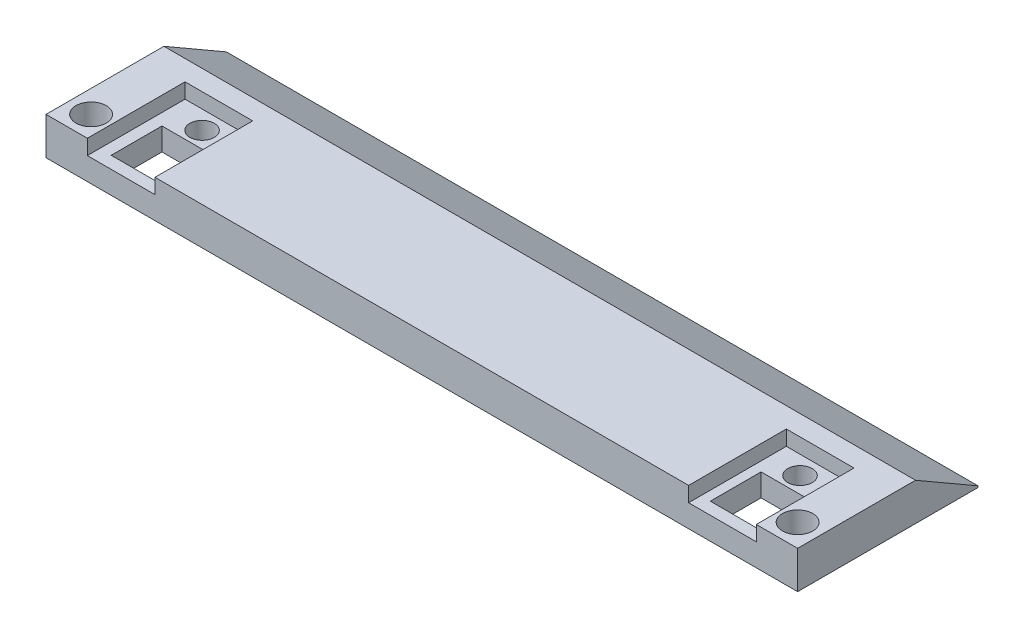
ISO-10303-21;
HEADER;
FILE_DESCRIPTION(('STEP AP214'),'2;1');
FILE_NAME('part.step','',(''),(''),'','','');
FILE_SCHEMA(('AUTOMOTIVE_DESIGN { 1 0 10303 214 1 1 1 1 }'));
ENDSEC;
DATA;
#1=APPLICATION_CONTEXT('core data for automotive mechanical design processes');
#2=APPLICATION_PROTOCOL_DEFINITION('international standard','automotive_design',2000,#1);
#3=PRODUCT_CONTEXT('',#1,'mechanical');
#4=PRODUCT('Part','Part','',(#3));
#5=PRODUCT_RELATED_PRODUCT_CATEGORY('part','',(#4));
#6=PRODUCT_DEFINITION_FORMATION('','',#4);
#7=PRODUCT_DEFINITION_CONTEXT('part definition',#1,'design');
#8=PRODUCT_DEFINITION('design','',#6,#7);
#9=PRODUCT_DEFINITION_SHAPE('','',#8);
#10=(LENGTH_UNIT() NAMED_UNIT(*) SI_UNIT(.MILLI.,.METRE.));
#11=(NAMED_UNIT(*) PLANE_ANGLE_UNIT() SI_UNIT($,.RADIAN.));
#12=(NAMED_UNIT(*) SI_UNIT($,.STERADIAN.) SOLID_ANGLE_UNIT());
#13=UNCERTAINTY_MEASURE_WITH_UNIT(LENGTH_MEASURE(1.E-05),#10,'distance_accuracy_value','');
#14=(GEOMETRIC_REPRESENTATION_CONTEXT(3) GLOBAL_UNCERTAINTY_ASSIGNED_CONTEXT((#13)) GLOBAL_UNIT_ASSIGNED_CONTEXT((#10,
#11,#12)) REPRESENTATION_CONTEXT('',''));
#15=CARTESIAN_POINT('',(0.,0.,0.));
#16=DIRECTION('',(0.,0.,1.));
#17=DIRECTION('',(1.,0.,0.));
#18=AXIS2_PLACEMENT_3D('',#15,#16,#17);
#19=CARTESIAN_POINT('',(0.,5.,3.62266803382196));
#20=DIRECTION('',(0.,0.,-1.));
#21=DIRECTION('',(-1.,0.,0.));
#22=AXIS2_PLACEMENT_3D('',#19,#20,#21);
#23=PLANE('',#22);
#24=DIRECTION('',(1.,0.,0.));
#25=VECTOR('',#24,1.);
#26=CARTESIAN_POINT('',(0.,3.,3.62266803382196));
#27=LINE('',#26,#25);
#28=CARTESIAN_POINT('',(-42.9485841082923,3.,3.62266803382196));
#29=VERTEX_POINT('',#28);
#30=CARTESIAN_POINT('',(-37.0514158917077,3.,3.62266803382196));
#31=VERTEX_POINT('',#30);
#32=EDGE_CURVE('E247',#29,#31,#27,.T.);
#33=ORIENTED_EDGE('',*,*,#32,.F.);
#34=DIRECTION('',(0.,-1.,0.));
#35=VECTOR('',#34,1.);
#36=CARTESIAN_POINT('',(-42.9485841082923,5.,3.62266803382196));
#37=LINE('',#36,#35);
#38=CARTESIAN_POINT('',(-42.9485841082923,0.,3.62266803382196));
#39=VERTEX_POINT('',#38);
#40=EDGE_CURVE('E351',#29,#39,#37,.T.);
#41=ORIENTED_EDGE('',*,*,#40,.T.);
#42=DIRECTION('',(1.,0.,0.));
#43=VECTOR('',#42,1.);
#44=CARTESIAN_POINT('',(0.,0.,3.62266803382196));
#45=LINE('',#44,#43);
#46=CARTESIAN_POINT('',(-37.0514158917077,0.,3.62266803382196));
#47=VERTEX_POINT('',#46);
#48=EDGE_CURVE('E340',#39,#47,#45,.T.);
#49=ORIENTED_EDGE('',*,*,#48,.T.);
#50=DIRECTION('',(0.,-1.,0.));
#51=VECTOR('',#50,1.);
#52=CARTESIAN_POINT('',(-37.0514158917077,5.,3.62266803382196));
#53=LINE('',#52,#51);
#54=EDGE_CURVE('E215',#31,#47,#53,.T.);
#55=ORIENTED_EDGE('',*,*,#54,.F.);
#56=EDGE_LOOP('',(#33,#41,#49,#55));
#57=FACE_BOUND('',#56,.T.);
#58=ADVANCED_FACE('F37',(#57),#23,.F.);
#59=CARTESIAN_POINT('',(-37.0514158917077,5.,0.));
#60=DIRECTION('',(1.,0.,0.));
#61=DIRECTION('',(0.,0.,-1.));
#62=AXIS2_PLACEMENT_3D('',#59,#60,#61);
#63=PLANE('',#62);
#64=DIRECTION('',(0.,0.,1.));
#65=VECTOR('',#64,1.);
#66=CARTESIAN_POINT('',(-37.0514158917077,3.,0.));
#67=LINE('',#66,#65);
#68=CARTESIAN_POINT('',(-37.0514158917077,3.,10.377331966178));
#69=VERTEX_POINT('',#68);
#70=EDGE_CURVE('E249',#31,#69,#67,.T.);
#71=ORIENTED_EDGE('',*,*,#70,.F.);
#72=ORIENTED_EDGE('',*,*,#54,.T.);
#73=DIRECTION('',(0.,0.,1.));
#74=VECTOR('',#73,1.);
#75=CARTESIAN_POINT('',(-37.0514158917077,0.,0.));
#76=LINE('',#75,#74);
#77=CARTESIAN_POINT('',(-37.0514158917077,0.,10.377331966178));
#78=VERTEX_POINT('',#77);
#79=EDGE_CURVE('E343',#47,#78,#76,.T.);
#80=ORIENTED_EDGE('',*,*,#79,.T.);
#81=DIRECTION('',(0.,-1.,0.));
#82=VECTOR('',#81,1.);
#83=CARTESIAN_POINT('',(-37.0514158917077,5.,10.377331966178));
#84=LINE('',#83,#82);
#85=EDGE_CURVE('E355',#69,#78,#84,.T.);
#86=ORIENTED_EDGE('',*,*,#85,.F.);
#87=EDGE_LOOP('',(#71,#72,#80,#86));
#88=FACE_BOUND('',#87,.T.);
#89=ADVANCED_FACE('F393',(#88),#63,.F.);
#90=CARTESIAN_POINT('',(0.,5.,10.377331966178));
#91=DIRECTION('',(0.,0.,-1.));
#92=DIRECTION('',(-1.,0.,0.));
#93=AXIS2_PLACEMENT_3D('',#90,#91,#92);
#94=PLANE('',#93);
#95=DIRECTION('',(0.,-1.,0.));
#96=VECTOR('',#95,1.);
#97=CARTESIAN_POINT('',(-42.9485841082923,5.,10.377331966178));
#98=LINE('',#97,#96);
#99=CARTESIAN_POINT('',(-42.9485841082923,3.,10.377331966178));
#100=VERTEX_POINT('',#99);
#101=CARTESIAN_POINT('',(-42.9485841082923,0.,10.377331966178));
#102=VERTEX_POINT('',#101);
#103=EDGE_CURVE('E353',#100,#102,#98,.T.);
#104=ORIENTED_EDGE('',*,*,#103,.F.);
#105=DIRECTION('',(-1.,0.,0.));
#106=VECTOR('',#105,1.);
#107=CARTESIAN_POINT('',(0.,3.,10.377331966178));
#108=LINE('',#107,#106);
#109=EDGE_CURVE('E251',#69,#100,#108,.T.);
#110=ORIENTED_EDGE('',*,*,#109,.F.);
#111=ORIENTED_EDGE('',*,*,#85,.T.);
#112=DIRECTION('',(1.,0.,0.));
#113=VECTOR('',#112,1.);
#114=CARTESIAN_POINT('',(0.,0.,10.377331966178));
#115=LINE('',#114,#113);
#116=EDGE_CURVE('E346',#102,#78,#115,.T.);
#117=ORIENTED_EDGE('',*,*,#116,.F.);
#118=EDGE_LOOP('',(#104,#110,#111,#117));
#119=FACE_BOUND('',#118,.T.);
#120=ADVANCED_FACE('F399',(#119),#94,.T.);
#121=CARTESIAN_POINT('',(0.,5.,3.62266803382197));
#122=DIRECTION('',(0.,0.,-1.));
#123=DIRECTION('',(-1.,0.,0.));
#124=AXIS2_PLACEMENT_3D('',#121,#122,#123);
#125=PLANE('',#124);
#126=DIRECTION('',(1.,0.,0.));
#127=VECTOR('',#126,1.);
#128=CARTESIAN_POINT('',(0.,3.,3.62266803382197));
#129=LINE('',#128,#127);
#130=CARTESIAN_POINT('',(36.7611168075918,3.,3.62266803382197));
#131=VERTEX_POINT('',#130);
#132=CARTESIAN_POINT('',(43.2388831924083,3.,3.62266803382197));
#133=VERTEX_POINT('',#132);
#134=EDGE_CURVE('E300',#131,#133,#129,.T.);
#135=ORIENTED_EDGE('',*,*,#134,.F.);
#136=DIRECTION('',(0.,-1.,0.));
#137=VECTOR('',#136,1.);
#138=CARTESIAN_POINT('',(36.7611168075918,5.,3.62266803382197));
#139=LINE('',#138,#137);
#140=CARTESIAN_POINT('',(36.7611168075918,0.,3.62266803382197));
#141=VERTEX_POINT('',#140);
#142=EDGE_CURVE('E214',#131,#141,#139,.T.);
#143=ORIENTED_EDGE('',*,*,#142,.T.);
#144=DIRECTION('',(1.,0.,0.));
#145=VECTOR('',#144,1.);
#146=CARTESIAN_POINT('',(0.,0.,3.62266803382197));
#147=LINE('',#146,#145);
#148=CARTESIAN_POINT('',(43.2388831924083,0.,3.62266803382197));
#149=VERTEX_POINT('',#148);
#150=EDGE_CURVE('E322',#141,#149,#147,.T.);
#151=ORIENTED_EDGE('',*,*,#150,.T.);
#152=DIRECTION('',(0.,-1.,0.));
#153=VECTOR('',#152,1.);
#154=CARTESIAN_POINT('',(43.2388831924083,5.,3.62266803382197));
#155=LINE('',#154,#153);
#156=EDGE_CURVE('E207',#133,#149,#155,.T.);
#157=ORIENTED_EDGE('',*,*,#156,.F.);
#158=EDGE_LOOP('',(#135,#143,#151,#157));
#159=FACE_BOUND('',#158,.T.);
#160=ADVANCED_FACE('F376',(#159),#125,.F.);
#161=CARTESIAN_POINT('',(43.2388831924083,5.,0.));
#162=DIRECTION('',(1.,0.,0.));
#163=DIRECTION('',(0.,0.,-1.));
#164=AXIS2_PLACEMENT_3D('',#161,#162,#163);
#165=PLANE('',#164);
#166=DIRECTION('',(0.,0.,1.));
#167=VECTOR('',#166,1.);
#168=CARTESIAN_POINT('',(43.2388831924083,3.,0.));
#169=LINE('',#168,#167);
#170=CARTESIAN_POINT('',(43.2388831924083,3.,10.377331966178));
#171=VERTEX_POINT('',#170);
#172=EDGE_CURVE('E298',#133,#171,#169,.T.);
#173=ORIENTED_EDGE('',*,*,#172,.F.);
#174=ORIENTED_EDGE('',*,*,#156,.T.);
#175=DIRECTION('',(0.,0.,1.));
#176=VECTOR('',#175,1.);
#177=CARTESIAN_POINT('',(43.2388831924083,0.,0.));
#178=LINE('',#177,#176);
#179=CARTESIAN_POINT('',(43.2388831924083,0.,10.377331966178));
#180=VERTEX_POINT('',#179);
#181=EDGE_CURVE('E325',#149,#180,#178,.T.);
#182=ORIENTED_EDGE('',*,*,#181,.T.);
#183=DIRECTION('',(0.,-1.,0.));
#184=VECTOR('',#183,1.);
#185=CARTESIAN_POINT('',(43.2388831924083,5.,10.377331966178));
#186=LINE('',#185,#184);
#187=EDGE_CURVE('E360',#171,#180,#186,.T.);
#188=ORIENTED_EDGE('',*,*,#187,.F.);
#189=EDGE_LOOP('',(#173,#174,#182,#188));
#190=FACE_BOUND('',#189,.T.);
#191=ADVANCED_FACE('F368',(#190),#165,.F.);
#192=CARTESIAN_POINT('',(0.,5.,10.377331966178));
#193=DIRECTION('',(0.,0.,-1.));
#194=DIRECTION('',(-1.,0.,0.));
#195=AXIS2_PLACEMENT_3D('',#192,#193,#194);
#196=PLANE('',#195);
#197=DIRECTION('',(0.,-1.,0.));
#198=VECTOR('',#197,1.);
#199=CARTESIAN_POINT('',(36.7611168075918,5.,10.377331966178));
#200=LINE('',#199,#198);
#201=CARTESIAN_POINT('',(36.7611168075918,3.,10.377331966178));
#202=VERTEX_POINT('',#201);
#203=CARTESIAN_POINT('',(36.7611168075918,0.,10.377331966178));
#204=VERTEX_POINT('',#203);
#205=EDGE_CURVE('E359',#202,#204,#200,.T.);
#206=ORIENTED_EDGE('',*,*,#205,.F.);
#207=DIRECTION('',(1.,0.,0.));
#208=VECTOR('',#207,1.);
#209=CARTESIAN_POINT('',(0.,3.,10.377331966178));
#210=LINE('',#209,#208);
#211=EDGE_CURVE('E61',#202,#171,#210,.T.);
#212=ORIENTED_EDGE('',*,*,#211,.T.);
#213=ORIENTED_EDGE('',*,*,#187,.T.);
#214=DIRECTION('',(1.,0.,0.));
#215=VECTOR('',#214,1.);
#216=CARTESIAN_POINT('',(0.,0.,10.377331966178));
#217=LINE('',#216,#215);
#218=EDGE_CURVE('E328',#204,#180,#217,.T.);
#219=ORIENTED_EDGE('',*,*,#218,.F.);
#220=EDGE_LOOP('',(#206,#212,#213,#219));
#221=FACE_BOUND('',#220,.T.);
#222=ADVANCED_FACE('F381',(#221),#196,.T.);
#223=CARTESIAN_POINT('',(0.,5.,12.));
#224=DIRECTION('',(0.,0.,-1.));
#225=DIRECTION('',(-1.,0.,0.));
#226=AXIS2_PLACEMENT_3D('',#223,#224,#225);
#227=PLANE('',#226);
#228=DIRECTION('',(0.,1.,0.));
#229=VECTOR('',#228,1.);
#230=CARTESIAN_POINT('',(-44.5,3.,12.));
#231=LINE('',#230,#229);
#232=CARTESIAN_POINT('',(-44.5,3.,12.));
#233=VERTEX_POINT('',#232);
#234=CARTESIAN_POINT('',(-44.5,5.,12.));
#235=VERTEX_POINT('',#234);
#236=EDGE_CURVE('E253',#233,#235,#231,.T.);
#237=ORIENTED_EDGE('',*,*,#236,.T.);
#238=DIRECTION('',(1.,0.,0.));
#239=VECTOR('',#238,1.);
#240=CARTESIAN_POINT('',(0.,5.,12.));
#241=LINE('',#240,#239);
#242=CARTESIAN_POINT('',(-50.,5.,12.));
#243=VERTEX_POINT('',#242);
#244=EDGE_CURVE('E306',#243,#235,#241,.T.);
#245=ORIENTED_EDGE('',*,*,#244,.F.);
#246=DIRECTION('',(0.,-1.,0.));
#247=VECTOR('',#246,1.);
#248=CARTESIAN_POINT('',(-50.,5.,12.));
#249=LINE('',#248,#247);
#250=CARTESIAN_POINT('',(-50.,0.,12.));
#251=VERTEX_POINT('',#250);
#252=EDGE_CURVE('E211',#243,#251,#249,.T.);
#253=ORIENTED_EDGE('',*,*,#252,.T.);
#254=DIRECTION('',(1.,0.,0.));
#255=VECTOR('',#254,1.);
#256=CARTESIAN_POINT('',(0.,0.,12.));
#257=LINE('',#256,#255);
#258=CARTESIAN_POINT('',(50.,0.,12.));
#259=VERTEX_POINT('',#258);
#260=EDGE_CURVE('E315',#251,#259,#257,.T.);
#261=ORIENTED_EDGE('',*,*,#260,.T.);
#262=DIRECTION('',(0.,-1.,0.));
#263=VECTOR('',#262,1.);
#264=CARTESIAN_POINT('',(50.,5.,12.));
#265=LINE('',#264,#263);
#266=CARTESIAN_POINT('',(50.,5.,12.));
#267=VERTEX_POINT('',#266);
#268=EDGE_CURVE('E201',#267,#259,#265,.T.);
#269=ORIENTED_EDGE('',*,*,#268,.F.);
#270=CARTESIAN_POINT('',(44.5,5.,12.));
#271=VERTEX_POINT('',#270);
#272=EDGE_CURVE('E304',#271,#267,#241,.T.);
#273=ORIENTED_EDGE('',*,*,#272,.F.);
#274=DIRECTION('',(0.,1.,0.));
#275=VECTOR('',#274,1.);
#276=CARTESIAN_POINT('',(44.5,3.,12.));
#277=LINE('',#276,#275);
#278=CARTESIAN_POINT('',(44.5,3.,12.));
#279=VERTEX_POINT('',#278);
#280=EDGE_CURVE('E271',#279,#271,#277,.T.);
#281=ORIENTED_EDGE('',*,*,#280,.F.);
#282=DIRECTION('',(1.,0.,0.));
#283=VECTOR('',#282,1.);
#284=CARTESIAN_POINT('',(35.5,3.,12.));
#285=LINE('',#284,#283);
#286=CARTESIAN_POINT('',(35.5,3.,12.));
#287=VERTEX_POINT('',#286);
#288=EDGE_CURVE('E284',#287,#279,#285,.T.);
#289=ORIENTED_EDGE('',*,*,#288,.F.);
#290=DIRECTION('',(0.,1.,0.));
#291=VECTOR('',#290,1.);
#292=CARTESIAN_POINT('',(35.5,3.,12.));
#293=LINE('',#292,#291);
#294=CARTESIAN_POINT('',(35.5,5.,12.));
#295=VERTEX_POINT('',#294);
#296=EDGE_CURVE('E232',#287,#295,#293,.T.);
#297=ORIENTED_EDGE('',*,*,#296,.T.);
#298=CARTESIAN_POINT('',(-35.5,5.,12.));
#299=VERTEX_POINT('',#298);
#300=EDGE_CURVE('E310',#299,#295,#241,.T.);
#301=ORIENTED_EDGE('',*,*,#300,.F.);
#302=DIRECTION('',(0.,1.,0.));
#303=VECTOR('',#302,1.);
#304=CARTESIAN_POINT('',(-35.5,3.,12.));
#305=LINE('',#304,#303);
#306=CARTESIAN_POINT('',(-35.5,3.,12.));
#307=VERTEX_POINT('',#306);
#308=EDGE_CURVE('E267',#307,#299,#305,.T.);
#309=ORIENTED_EDGE('',*,*,#308,.F.);
#310=DIRECTION('',(1.,0.,0.));
#311=VECTOR('',#310,1.);
#312=CARTESIAN_POINT('',(0.,3.,12.));
#313=LINE('',#312,#311);
#314=EDGE_CURVE('E235',#233,#307,#313,.T.);
#315=ORIENTED_EDGE('',*,*,#314,.F.);
#316=EDGE_LOOP('',(#237,#245,#253,#261,#269,#273,#281,#289,#297,#301,#309,#315));
#317=FACE_BOUND('',#316,.T.);
#318=ADVANCED_FACE('F383',(#317),#227,.F.);
#319=CARTESIAN_POINT('',(36.7611168075918,5.,0.));
#320=DIRECTION('',(1.,0.,0.));
#321=DIRECTION('',(0.,0.,-1.));
#322=AXIS2_PLACEMENT_3D('',#319,#320,#321);
#323=PLANE('',#322);
#324=ORIENTED_EDGE('',*,*,#142,.F.);
#325=DIRECTION('',(0.,0.,1.));
#326=VECTOR('',#325,1.);
#327=CARTESIAN_POINT('',(36.7611168075918,3.,0.));
#328=LINE('',#327,#326);
#329=EDGE_CURVE('E46',#131,#202,#328,.T.);
#330=ORIENTED_EDGE('',*,*,#329,.T.);
#331=ORIENTED_EDGE('',*,*,#205,.T.);
#332=DIRECTION('',(0.,0.,1.));
#333=VECTOR('',#332,1.);
#334=CARTESIAN_POINT('',(36.7611168075918,0.,0.));
#335=LINE('',#334,#333);
#336=EDGE_CURVE('E331',#141,#204,#335,.T.);
#337=ORIENTED_EDGE('',*,*,#336,.F.);
#338=EDGE_LOOP('',(#324,#330,#331,#337));
#339=FACE_BOUND('',#338,.T.);
#340=ADVANCED_FACE('F379',(#339),#323,.T.);
#341=CARTESIAN_POINT('',(-42.9485841082923,5.,0.));
#342=DIRECTION('',(1.,0.,0.));
#343=DIRECTION('',(0.,0.,-1.));
#344=AXIS2_PLACEMENT_3D('',#341,#342,#343);
#345=PLANE('',#344);
#346=ORIENTED_EDGE('',*,*,#40,.F.);
#347=DIRECTION('',(0.,0.,-1.));
#348=VECTOR('',#347,1.);
#349=CARTESIAN_POINT('',(-42.9485841082923,3.,0.));
#350=LINE('',#349,#348);
#351=EDGE_CURVE('E245',#100,#29,#350,.T.);
#352=ORIENTED_EDGE('',*,*,#351,.F.);
#353=ORIENTED_EDGE('',*,*,#103,.T.);
#354=DIRECTION('',(0.,0.,1.));
#355=VECTOR('',#354,1.);
#356=CARTESIAN_POINT('',(-42.9485841082923,0.,0.));
#357=LINE('',#356,#355);
#358=EDGE_CURVE('E305',#39,#102,#357,.T.);
#359=ORIENTED_EDGE('',*,*,#358,.F.);
#360=EDGE_LOOP('',(#346,#352,#353,#359));
#361=FACE_BOUND('',#360,.T.);
#362=ADVANCED_FACE('F414',(#361),#345,.T.);
#363=CARTESIAN_POINT('',(0.,5.,0.));
#364=DIRECTION('',(0.,1.,0.));
#365=DIRECTION('',(0.,0.,1.));
#366=AXIS2_PLACEMENT_3D('',#363,#364,#365);
#367=PLANE('',#366);
#368=DIRECTION('',(1.,0.,0.));
#369=VECTOR('',#368,1.);
#370=CARTESIAN_POINT('',(0.,5.,-3.68615612366942));
#371=LINE('',#370,#369);
#372=CARTESIAN_POINT('',(-50.,5.,-3.68615612366942));
#373=VERTEX_POINT('',#372);
#374=CARTESIAN_POINT('',(50.,5.,-3.68615612366942));
#375=VERTEX_POINT('',#374);
#376=EDGE_CURVE('E230',#373,#375,#371,.T.);
#377=ORIENTED_EDGE('',*,*,#376,.F.);
#378=DIRECTION('',(0.,0.,1.));
#379=VECTOR('',#378,1.);
#380=CARTESIAN_POINT('',(-50.,5.,0.));
#381=LINE('',#380,#379);
#382=EDGE_CURVE('E191',#373,#243,#381,.T.);
#383=ORIENTED_EDGE('',*,*,#382,.T.);
#384=ORIENTED_EDGE('',*,*,#244,.T.);
#385=DIRECTION('',(0.,0.,-1.));
#386=VECTOR('',#385,1.);
#387=CARTESIAN_POINT('',(-44.5,5.,0.));
#388=LINE('',#387,#386);
#389=CARTESIAN_POINT('',(-44.5,5.,-0.999999999999996));
#390=VERTEX_POINT('',#389);
#391=EDGE_CURVE('E254',#235,#390,#388,.T.);
#392=ORIENTED_EDGE('',*,*,#391,.T.);
#393=DIRECTION('',(-1.,0.,0.));
#394=VECTOR('',#393,1.);
#395=CARTESIAN_POINT('',(0.,5.,-1.00000000000001));
#396=LINE('',#395,#394);
#397=CARTESIAN_POINT('',(-35.5,5.,-0.999999999999999));
#398=VERTEX_POINT('',#397);
#399=EDGE_CURVE('E236',#398,#390,#396,.T.);
#400=ORIENTED_EDGE('',*,*,#399,.F.);
#401=DIRECTION('',(0.,0.,-1.));
#402=VECTOR('',#401,1.);
#403=CARTESIAN_POINT('',(-35.5,5.,0.));
#404=LINE('',#403,#402);
#405=EDGE_CURVE('E257',#299,#398,#404,.T.);
#406=ORIENTED_EDGE('',*,*,#405,.F.);
#407=ORIENTED_EDGE('',*,*,#300,.T.);
#408=DIRECTION('',(0.,0.,-1.));
#409=VECTOR('',#408,1.);
#410=CARTESIAN_POINT('',(35.5,5.,12.));
#411=LINE('',#410,#409);
#412=CARTESIAN_POINT('',(35.5,5.,-0.999999999999999));
#413=VERTEX_POINT('',#412);
#414=EDGE_CURVE('E280',#295,#413,#411,.T.);
#415=ORIENTED_EDGE('',*,*,#414,.T.);
#416=DIRECTION('',(1.,0.,0.));
#417=VECTOR('',#416,1.);
#418=CARTESIAN_POINT('',(35.5,5.,-0.999999999999999));
#419=LINE('',#418,#417);
#420=CARTESIAN_POINT('',(44.5,5.,-0.999999999999996));
#421=VERTEX_POINT('',#420);
#422=EDGE_CURVE('E283',#413,#421,#419,.T.);
#423=ORIENTED_EDGE('',*,*,#422,.T.);
#424=DIRECTION('',(0.,0.,-1.));
#425=VECTOR('',#424,1.);
#426=CARTESIAN_POINT('',(44.5,5.,12.));
#427=LINE('',#426,#425);
#428=EDGE_CURVE('E258',#271,#421,#427,.T.);
#429=ORIENTED_EDGE('',*,*,#428,.F.);
#430=ORIENTED_EDGE('',*,*,#272,.T.);
#431=DIRECTION('',(0.,0.,1.));
#432=VECTOR('',#431,1.);
#433=CARTESIAN_POINT('',(50.,5.,0.));
#434=LINE('',#433,#432);
#435=EDGE_CURVE('E309',#375,#267,#434,.T.);
#436=ORIENTED_EDGE('',*,*,#435,.F.);
#437=EDGE_LOOP('',(#377,#383,#384,#392,#400,#406,#407,#415,#423,#429,#430,#436));
#438=FACE_BOUND('',#437,.T.);
#439=CARTESIAN_POINT('',(-47.,5.,9.));
#440=DIRECTION('',(0.,1.,0.));
#441=DIRECTION('',(0.,0.,1.));
#442=AXIS2_PLACEMENT_3D('',#439,#440,#441);
#443=CIRCLE('',#442,2.01750494210506);
#444=CARTESIAN_POINT('',(-47.,5.,11.0175049421051));
#445=VERTEX_POINT('',#444);
#446=EDGE_CURVE('E204',#445,#445,#443,.T.);
#447=ORIENTED_EDGE('',*,*,#446,.F.);
#448=EDGE_LOOP('',(#447));
#449=FACE_BOUND('',#448,.T.);
#450=CARTESIAN_POINT('',(47.,5.,9.));
#451=DIRECTION('',(0.,1.,0.));
#452=DIRECTION('',(0.,0.,1.));
#453=AXIS2_PLACEMENT_3D('',#450,#451,#452);
#454=CIRCLE('',#453,2.01750494210506);
#455=CARTESIAN_POINT('',(47.,5.,11.0175049421051));
#456=VERTEX_POINT('',#455);
#457=EDGE_CURVE('E199',#456,#456,#454,.F.);
#458=ORIENTED_EDGE('',*,*,#457,.T.);
#459=EDGE_LOOP('',(#458));
#460=FACE_BOUND('',#459,.T.);
#461=ADVANCED_FACE('F418',(#438,#449,#460),#367,.T.);
#462=CARTESIAN_POINT('',(-50.,5.,0.));
#463=DIRECTION('',(1.,0.,0.));
#464=DIRECTION('',(0.,0.,-1.));
#465=AXIS2_PLACEMENT_3D('',#462,#463,#464);
#466=PLANE('',#465);
#467=ORIENTED_EDGE('',*,*,#382,.F.);
#468=DIRECTION('',(0.,0.500000000000001,0.866025403784438));
#469=VECTOR('',#468,1.);
#470=CARTESIAN_POINT('',(-50.,5.34615242270664,-3.08660254037846));
#471=LINE('',#470,#469);
#472=CARTESIAN_POINT('',(-50.,0.2,-12.));
#473=VERTEX_POINT('',#472);
#474=EDGE_CURVE('E180',#473,#373,#471,.T.);
#475=ORIENTED_EDGE('',*,*,#474,.F.);
#476=DIRECTION('',(0.,-1.,0.));
#477=VECTOR('',#476,1.);
#478=CARTESIAN_POINT('',(-50.,5.,-12.));
#479=LINE('',#478,#477);
#480=CARTESIAN_POINT('',(-50.,0.,-12.));
#481=VERTEX_POINT('',#480);
#482=EDGE_CURVE('E188',#473,#481,#479,.T.);
#483=ORIENTED_EDGE('',*,*,#482,.T.);
#484=DIRECTION('',(0.,0.,1.));
#485=VECTOR('',#484,1.);
#486=CARTESIAN_POINT('',(-50.,0.,0.));
#487=LINE('',#486,#485);
#488=EDGE_CURVE('E302',#481,#251,#487,.T.);
#489=ORIENTED_EDGE('',*,*,#488,.T.);
#490=ORIENTED_EDGE('',*,*,#252,.F.);
#491=EDGE_LOOP('',(#467,#475,#483,#489,#490));
#492=FACE_BOUND('',#491,.T.);
#493=ADVANCED_FACE('F39',(#492),#466,.F.);
#494=CARTESIAN_POINT('',(50.,5.,0.));
#495=DIRECTION('',(1.,0.,0.));
#496=DIRECTION('',(0.,0.,-1.));
#497=AXIS2_PLACEMENT_3D('',#494,#495,#496);
#498=PLANE('',#497);
#499=DIRECTION('',(0.,-0.500000000000001,-0.866025403784438));
#500=VECTOR('',#499,1.);
#501=CARTESIAN_POINT('',(50.,6.59615242270665,-0.921539030917359));
#502=LINE('',#501,#500);
#503=CARTESIAN_POINT('',(50.,0.2,-12.));
#504=VERTEX_POINT('',#503);
#505=EDGE_CURVE('E53',#375,#504,#502,.T.);
#506=ORIENTED_EDGE('',*,*,#505,.F.);
#507=ORIENTED_EDGE('',*,*,#435,.T.);
#508=ORIENTED_EDGE('',*,*,#268,.T.);
#509=DIRECTION('',(0.,0.,1.));
#510=VECTOR('',#509,1.);
#511=CARTESIAN_POINT('',(50.,0.,0.));
#512=LINE('',#511,#510);
#513=CARTESIAN_POINT('',(50.,0.,-12.));
#514=VERTEX_POINT('',#513);
#515=EDGE_CURVE('E318',#514,#259,#512,.T.);
#516=ORIENTED_EDGE('',*,*,#515,.F.);
#517=DIRECTION('',(0.,-1.,0.));
#518=VECTOR('',#517,1.);
#519=CARTESIAN_POINT('',(50.,5.,-12.));
#520=LINE('',#519,#518);
#521=EDGE_CURVE('E198',#504,#514,#520,.T.);
#522=ORIENTED_EDGE('',*,*,#521,.F.);
#523=EDGE_LOOP('',(#506,#507,#508,#516,#522));
#524=FACE_BOUND('',#523,.T.);
#525=ADVANCED_FACE('F409',(#524),#498,.T.);
#526=CARTESIAN_POINT('',(47.,5.,9.));
#527=DIRECTION('',(0.,-1.,0.));
#528=DIRECTION('',(0.,0.,-1.));
#529=AXIS2_PLACEMENT_3D('',#526,#527,#528);
#530=CYLINDRICAL_SURFACE('',#529,2.01750494210506);
#531=ORIENTED_EDGE('',*,*,#457,.F.);
#532=EDGE_LOOP('',(#531));
#533=FACE_BOUND('',#532,.T.);
#534=CARTESIAN_POINT('',(47.,0.,9.));
#535=DIRECTION('',(0.,1.,0.));
#536=DIRECTION('',(0.,0.,1.));
#537=AXIS2_PLACEMENT_3D('',#534,#535,#536);
#538=CIRCLE('',#537,2.01750494210506);
#539=CARTESIAN_POINT('',(47.,0.,11.0175049421051));
#540=VERTEX_POINT('',#539);
#541=EDGE_CURVE('E337',#540,#540,#538,.F.);
#542=ORIENTED_EDGE('',*,*,#541,.T.);
#543=EDGE_LOOP('',(#542));
#544=FACE_BOUND('',#543,.T.);
#545=ADVANCED_FACE('F405',(#533,#544),#530,.F.);
#546=CARTESIAN_POINT('',(-47.,5.,9.));
#547=DIRECTION('',(0.,-1.,0.));
#548=DIRECTION('',(0.,0.,-1.));
#549=AXIS2_PLACEMENT_3D('',#546,#547,#548);
#550=CYLINDRICAL_SURFACE('',#549,2.01750494210506);
#551=ORIENTED_EDGE('',*,*,#446,.T.);
#552=EDGE_LOOP('',(#551));
#553=FACE_BOUND('',#552,.T.);
#554=CARTESIAN_POINT('',(-47.,0.,9.));
#555=DIRECTION('',(0.,1.,0.));
#556=DIRECTION('',(0.,0.,1.));
#557=AXIS2_PLACEMENT_3D('',#554,#555,#556);
#558=CIRCLE('',#557,2.01750494210506);
#559=CARTESIAN_POINT('',(-47.,0.,11.0175049421051));
#560=VERTEX_POINT('',#559);
#561=EDGE_CURVE('E334',#560,#560,#558,.T.);
#562=ORIENTED_EDGE('',*,*,#561,.F.);
#563=EDGE_LOOP('',(#562));
#564=FACE_BOUND('',#563,.T.);
#565=ADVANCED_FACE('F408',(#553,#564),#550,.F.);
#566=CARTESIAN_POINT('',(0.,5.,-12.));
#567=DIRECTION('',(0.,0.,-1.));
#568=DIRECTION('',(-1.,0.,0.));
#569=AXIS2_PLACEMENT_3D('',#566,#567,#568);
#570=PLANE('',#569);
#571=DIRECTION('',(-1.,0.,0.));
#572=VECTOR('',#571,1.);
#573=CARTESIAN_POINT('',(0.,0.2,-12.));
#574=LINE('',#573,#572);
#575=EDGE_CURVE('E11',#504,#473,#574,.T.);
#576=ORIENTED_EDGE('',*,*,#575,.F.);
#577=ORIENTED_EDGE('',*,*,#521,.T.);
#578=DIRECTION('',(1.,0.,0.));
#579=VECTOR('',#578,1.);
#580=CARTESIAN_POINT('',(0.,0.,-12.));
#581=LINE('',#580,#579);
#582=EDGE_CURVE('E197',#481,#514,#581,.T.);
#583=ORIENTED_EDGE('',*,*,#582,.F.);
#584=ORIENTED_EDGE('',*,*,#482,.F.);
#585=EDGE_LOOP('',(#576,#577,#583,#584));
#586=FACE_BOUND('',#585,.T.);
#587=ADVANCED_FACE('F195',(#586),#570,.T.);
#588=CARTESIAN_POINT('',(0.,0.,0.));
#589=DIRECTION('',(0.,1.,0.));
#590=DIRECTION('',(0.,0.,1.));
#591=AXIS2_PLACEMENT_3D('',#588,#589,#590);
#592=PLANE('',#591);
#593=CARTESIAN_POINT('',(39.7783713725474,0.,1.45930072075137));
#594=DIRECTION('',(0.,1.,0.));
#595=DIRECTION('',(0.,0.,1.));
#596=AXIS2_PLACEMENT_3D('',#593,#594,#595);
#597=CIRCLE('',#596,1.62679858725769);
#598=CARTESIAN_POINT('',(39.7783713725474,0.,3.08609930800906));
#599=VERTEX_POINT('',#598);
#600=EDGE_CURVE('E192',#599,#599,#597,.T.);
#601=ORIENTED_EDGE('',*,*,#600,.T.);
#602=EDGE_LOOP('',(#601));
#603=FACE_BOUND('',#602,.T.);
#604=CARTESIAN_POINT('',(-39.7783713725474,0.,1.45930072075137));
#605=DIRECTION('',(0.,1.,0.));
#606=DIRECTION('',(0.,0.,1.));
#607=AXIS2_PLACEMENT_3D('',#604,#605,#606);
#608=CIRCLE('',#607,1.62679858725769);
#609=CARTESIAN_POINT('',(-39.7783713725474,0.,3.08609930800906));
#610=VERTEX_POINT('',#609);
#611=EDGE_CURVE('E218',#610,#610,#608,.T.);
#612=ORIENTED_EDGE('',*,*,#611,.T.);
#613=EDGE_LOOP('',(#612));
#614=FACE_BOUND('',#613,.T.);
#615=ORIENTED_EDGE('',*,*,#488,.F.);
#616=ORIENTED_EDGE('',*,*,#582,.T.);
#617=ORIENTED_EDGE('',*,*,#515,.T.);
#618=ORIENTED_EDGE('',*,*,#260,.F.);
#619=EDGE_LOOP('',(#615,#616,#617,#618));
#620=FACE_BOUND('',#619,.T.);
#621=ORIENTED_EDGE('',*,*,#150,.F.);
#622=ORIENTED_EDGE('',*,*,#336,.T.);
#623=ORIENTED_EDGE('',*,*,#218,.T.);
#624=ORIENTED_EDGE('',*,*,#181,.F.);
#625=EDGE_LOOP('',(#621,#622,#623,#624));
#626=FACE_BOUND('',#625,.T.);
#627=ORIENTED_EDGE('',*,*,#561,.T.);
#628=EDGE_LOOP('',(#627));
#629=FACE_BOUND('',#628,.T.);
#630=ORIENTED_EDGE('',*,*,#541,.F.);
#631=EDGE_LOOP('',(#630));
#632=FACE_BOUND('',#631,.T.);
#633=ORIENTED_EDGE('',*,*,#48,.F.);
#634=ORIENTED_EDGE('',*,*,#358,.T.);
#635=ORIENTED_EDGE('',*,*,#116,.T.);
#636=ORIENTED_EDGE('',*,*,#79,.F.);
#637=EDGE_LOOP('',(#633,#634,#635,#636));
#638=FACE_BOUND('',#637,.T.);
#639=ADVANCED_FACE('F373',(#603,#614,#620,#626,#629,#632,#638),#592,.F.);
#640=CARTESIAN_POINT('',(0.,3.,0.));
#641=DIRECTION('',(0.,1.,0.));
#642=DIRECTION('',(0.,0.,1.));
#643=AXIS2_PLACEMENT_3D('',#640,#641,#642);
#644=PLANE('',#643);
#645=CARTESIAN_POINT('',(39.7783713725474,3.,1.45930072075137));
#646=DIRECTION('',(0.,1.,0.));
#647=DIRECTION('',(0.,0.,1.));
#648=AXIS2_PLACEMENT_3D('',#645,#646,#647);
#649=CIRCLE('',#648,1.62679858725769);
#650=CARTESIAN_POINT('',(39.7783713725474,3.,3.08609930800906));
#651=VERTEX_POINT('',#650);
#652=EDGE_CURVE('E41',#651,#651,#649,.T.);
#653=ORIENTED_EDGE('',*,*,#652,.F.);
#654=EDGE_LOOP('',(#653));
#655=FACE_BOUND('',#654,.T.);
#656=ORIENTED_EDGE('',*,*,#288,.T.);
#657=DIRECTION('',(0.,0.,-1.));
#658=VECTOR('',#657,1.);
#659=CARTESIAN_POINT('',(44.5,3.,12.));
#660=LINE('',#659,#658);
#661=CARTESIAN_POINT('',(44.5,3.,-0.999999999999996));
#662=VERTEX_POINT('',#661);
#663=EDGE_CURVE('E292',#279,#662,#660,.T.);
#664=ORIENTED_EDGE('',*,*,#663,.T.);
#665=DIRECTION('',(1.,0.,0.));
#666=VECTOR('',#665,1.);
#667=CARTESIAN_POINT('',(35.5,3.,-0.999999999999999));
#668=LINE('',#667,#666);
#669=CARTESIAN_POINT('',(35.5,3.,-0.999999999999999));
#670=VERTEX_POINT('',#669);
#671=EDGE_CURVE('E290',#670,#662,#668,.T.);
#672=ORIENTED_EDGE('',*,*,#671,.F.);
#673=DIRECTION('',(0.,0.,-1.));
#674=VECTOR('',#673,1.);
#675=CARTESIAN_POINT('',(35.5,3.,12.));
#676=LINE('',#675,#674);
#677=EDGE_CURVE('E273',#287,#670,#676,.T.);
#678=ORIENTED_EDGE('',*,*,#677,.F.);
#679=EDGE_LOOP('',(#656,#664,#672,#678));
#680=FACE_BOUND('',#679,.T.);
#681=ORIENTED_EDGE('',*,*,#134,.T.);
#682=ORIENTED_EDGE('',*,*,#172,.T.);
#683=ORIENTED_EDGE('',*,*,#211,.F.);
#684=ORIENTED_EDGE('',*,*,#329,.F.);
#685=EDGE_LOOP('',(#681,#682,#683,#684));
#686=FACE_BOUND('',#685,.T.);
#687=ADVANCED_FACE('F448',(#655,#680,#686),#644,.T.);
#688=CARTESIAN_POINT('',(35.5,3.,12.));
#689=DIRECTION('',(1.,0.,0.));
#690=DIRECTION('',(0.,0.,-1.));
#691=AXIS2_PLACEMENT_3D('',#688,#689,#690);
#692=PLANE('',#691);
#693=ORIENTED_EDGE('',*,*,#414,.F.);
#694=ORIENTED_EDGE('',*,*,#296,.F.);
#695=ORIENTED_EDGE('',*,*,#677,.T.);
#696=DIRECTION('',(0.,1.,0.));
#697=VECTOR('',#696,1.);
#698=CARTESIAN_POINT('',(35.5,3.,-0.999999999999999));
#699=LINE('',#698,#697);
#700=EDGE_CURVE('E276',#670,#413,#699,.T.);
#701=ORIENTED_EDGE('',*,*,#700,.T.);
#702=EDGE_LOOP('',(#693,#694,#695,#701));
#703=FACE_BOUND('',#702,.T.);
#704=ADVANCED_FACE('F454',(#703),#692,.T.);
#705=CARTESIAN_POINT('',(35.5,3.,-0.999999999999999));
#706=DIRECTION('',(0.,0.,1.));
#707=DIRECTION('',(1.,0.,0.));
#708=AXIS2_PLACEMENT_3D('',#705,#706,#707);
#709=PLANE('',#708);
#710=ORIENTED_EDGE('',*,*,#422,.F.);
#711=ORIENTED_EDGE('',*,*,#700,.F.);
#712=ORIENTED_EDGE('',*,*,#671,.T.);
#713=DIRECTION('',(0.,1.,0.));
#714=VECTOR('',#713,1.);
#715=CARTESIAN_POINT('',(44.5,3.,-0.999999999999996));
#716=LINE('',#715,#714);
#717=EDGE_CURVE('E274',#662,#421,#716,.T.);
#718=ORIENTED_EDGE('',*,*,#717,.T.);
#719=EDGE_LOOP('',(#710,#711,#712,#718));
#720=FACE_BOUND('',#719,.T.);
#721=ADVANCED_FACE('F485',(#720),#709,.T.);
#722=CARTESIAN_POINT('',(44.5,3.,12.));
#723=DIRECTION('',(1.,0.,0.));
#724=DIRECTION('',(0.,0.,-1.));
#725=AXIS2_PLACEMENT_3D('',#722,#723,#724);
#726=PLANE('',#725);
#727=ORIENTED_EDGE('',*,*,#428,.T.);
#728=ORIENTED_EDGE('',*,*,#717,.F.);
#729=ORIENTED_EDGE('',*,*,#663,.F.);
#730=ORIENTED_EDGE('',*,*,#280,.T.);
#731=EDGE_LOOP('',(#727,#728,#729,#730));
#732=FACE_BOUND('',#731,.T.);
#733=ADVANCED_FACE('F487',(#732),#726,.F.);
#734=CARTESIAN_POINT('',(-44.5,3.,0.));
#735=DIRECTION('',(1.,0.,0.));
#736=DIRECTION('',(0.,0.,-1.));
#737=AXIS2_PLACEMENT_3D('',#734,#735,#736);
#738=PLANE('',#737);
#739=ORIENTED_EDGE('',*,*,#391,.F.);
#740=ORIENTED_EDGE('',*,*,#236,.F.);
#741=DIRECTION('',(0.,0.,-1.));
#742=VECTOR('',#741,1.);
#743=CARTESIAN_POINT('',(-44.5,3.,0.));
#744=LINE('',#743,#742);
#745=CARTESIAN_POINT('',(-44.5,3.,-0.999999999999996));
#746=VERTEX_POINT('',#745);
#747=EDGE_CURVE('E233',#233,#746,#744,.T.);
#748=ORIENTED_EDGE('',*,*,#747,.T.);
#749=DIRECTION('',(0.,1.,0.));
#750=VECTOR('',#749,1.);
#751=CARTESIAN_POINT('',(-44.5,3.,-0.999999999999996));
#752=LINE('',#751,#750);
#753=EDGE_CURVE('E263',#746,#390,#752,.T.);
#754=ORIENTED_EDGE('',*,*,#753,.T.);
#755=EDGE_LOOP('',(#739,#740,#748,#754));
#756=FACE_BOUND('',#755,.T.);
#757=ADVANCED_FACE('F489',(#756),#738,.T.);
#758=CARTESIAN_POINT('',(0.,3.,-1.00000000000001));
#759=DIRECTION('',(0.,0.,-1.));
#760=DIRECTION('',(-1.,0.,0.));
#761=AXIS2_PLACEMENT_3D('',#758,#759,#760);
#762=PLANE('',#761);
#763=ORIENTED_EDGE('',*,*,#399,.T.);
#764=ORIENTED_EDGE('',*,*,#753,.F.);
#765=DIRECTION('',(-1.,0.,0.));
#766=VECTOR('',#765,1.);
#767=CARTESIAN_POINT('',(0.,3.,-1.00000000000001));
#768=LINE('',#767,#766);
#769=CARTESIAN_POINT('',(-35.5,3.,-0.999999999999999));
#770=VERTEX_POINT('',#769);
#771=EDGE_CURVE('E242',#770,#746,#768,.T.);
#772=ORIENTED_EDGE('',*,*,#771,.F.);
#773=DIRECTION('',(0.,1.,0.));
#774=VECTOR('',#773,1.);
#775=CARTESIAN_POINT('',(-35.5,3.,-0.999999999999999));
#776=LINE('',#775,#774);
#777=EDGE_CURVE('E265',#770,#398,#776,.T.);
#778=ORIENTED_EDGE('',*,*,#777,.T.);
#779=EDGE_LOOP('',(#763,#764,#772,#778));
#780=FACE_BOUND('',#779,.T.);
#781=ADVANCED_FACE('F495',(#780),#762,.F.);
#782=CARTESIAN_POINT('',(-35.5,3.,0.));
#783=DIRECTION('',(1.,0.,0.));
#784=DIRECTION('',(0.,0.,-1.));
#785=AXIS2_PLACEMENT_3D('',#782,#783,#784);
#786=PLANE('',#785);
#787=ORIENTED_EDGE('',*,*,#405,.T.);
#788=ORIENTED_EDGE('',*,*,#777,.F.);
#789=DIRECTION('',(0.,0.,-1.));
#790=VECTOR('',#789,1.);
#791=CARTESIAN_POINT('',(-35.5,3.,0.));
#792=LINE('',#791,#790);
#793=EDGE_CURVE('E239',#307,#770,#792,.T.);
#794=ORIENTED_EDGE('',*,*,#793,.F.);
#795=ORIENTED_EDGE('',*,*,#308,.T.);
#796=EDGE_LOOP('',(#787,#788,#794,#795));
#797=FACE_BOUND('',#796,.T.);
#798=ADVANCED_FACE('F529',(#797),#786,.F.);
#799=CARTESIAN_POINT('',(0.,3.,0.));
#800=DIRECTION('',(0.,1.,0.));
#801=DIRECTION('',(0.,0.,1.));
#802=AXIS2_PLACEMENT_3D('',#799,#800,#801);
#803=PLANE('',#802);
#804=CARTESIAN_POINT('',(-39.7783713725474,3.,1.45930072075137));
#805=DIRECTION('',(0.,1.,0.));
#806=DIRECTION('',(0.,0.,1.));
#807=AXIS2_PLACEMENT_3D('',#804,#805,#806);
#808=CIRCLE('',#807,1.62679858725769);
#809=CARTESIAN_POINT('',(-39.7783713725474,3.,3.08609930800906));
#810=VERTEX_POINT('',#809);
#811=EDGE_CURVE('E216',#810,#810,#808,.T.);
#812=ORIENTED_EDGE('',*,*,#811,.F.);
#813=EDGE_LOOP('',(#812));
#814=FACE_BOUND('',#813,.T.);
#815=ORIENTED_EDGE('',*,*,#747,.F.);
#816=ORIENTED_EDGE('',*,*,#314,.T.);
#817=ORIENTED_EDGE('',*,*,#793,.T.);
#818=ORIENTED_EDGE('',*,*,#771,.T.);
#819=EDGE_LOOP('',(#815,#816,#817,#818));
#820=FACE_BOUND('',#819,.T.);
#821=ORIENTED_EDGE('',*,*,#351,.T.);
#822=ORIENTED_EDGE('',*,*,#32,.T.);
#823=ORIENTED_EDGE('',*,*,#70,.T.);
#824=ORIENTED_EDGE('',*,*,#109,.T.);
#825=EDGE_LOOP('',(#821,#822,#823,#824));
#826=FACE_BOUND('',#825,.T.);
#827=ADVANCED_FACE('F441',(#814,#820,#826),#803,.T.);
#828=CARTESIAN_POINT('',(91.,5.34615242270664,-3.08660254037846));
#829=DIRECTION('',(0.,-0.866025403784438,0.500000000000001));
#830=DIRECTION('',(0.,-0.500000000000001,-0.866025403784438));
#831=AXIS2_PLACEMENT_3D('',#828,#829,#830);
#832=PLANE('',#831);
#833=ORIENTED_EDGE('',*,*,#376,.T.);
#834=ORIENTED_EDGE('',*,*,#505,.T.);
#835=ORIENTED_EDGE('',*,*,#575,.T.);
#836=ORIENTED_EDGE('',*,*,#474,.T.);
#837=EDGE_LOOP('',(#833,#834,#835,#836));
#838=FACE_BOUND('',#837,.T.);
#839=ADVANCED_FACE('F179',(#838),#832,.F.);
#840=CARTESIAN_POINT('',(-39.7783713725474,-23.,1.45930072075137));
#841=DIRECTION('',(0.,1.,0.));
#842=DIRECTION('',(0.,0.,1.));
#843=AXIS2_PLACEMENT_3D('',#840,#841,#842);
#844=CYLINDRICAL_SURFACE('',#843,1.62679858725769);
#845=CARTESIAN_POINT('',(-39.7783713725474,3.,3.08609930800906));
#846=CARTESIAN_POINT('',(-39.7783713725474,2.96875,3.08609930800906));
#847=CARTESIAN_POINT('',(-39.7783713725474,2.9375,3.08609930800906));
#848=CARTESIAN_POINT('',(-39.7783713725474,2.875,3.08609930800906));
#849=CARTESIAN_POINT('',(-39.7783713725474,2.84375,3.08609930800906));
#850=CARTESIAN_POINT('',(-39.7783713725474,2.78125,3.08609930800906));
#851=CARTESIAN_POINT('',(-39.7783713725474,2.75,3.08609930800906));
#852=CARTESIAN_POINT('',(-39.7783713725474,2.6875,3.08609930800906));
#853=CARTESIAN_POINT('',(-39.7783713725474,2.65625,3.08609930800906));
#854=CARTESIAN_POINT('',(-39.7783713725474,2.59375,3.08609930800906));
#855=CARTESIAN_POINT('',(-39.7783713725474,2.5625,3.08609930800906));
#856=CARTESIAN_POINT('',(-39.7783713725474,2.5,3.08609930800906));
#857=CARTESIAN_POINT('',(-39.7783713725474,2.46875,3.08609930800906));
#858=CARTESIAN_POINT('',(-39.7783713725474,2.40625,3.08609930800906));
#859=CARTESIAN_POINT('',(-39.7783713725474,2.375,3.08609930800906));
#860=CARTESIAN_POINT('',(-39.7783713725474,2.3125,3.08609930800906));
#861=CARTESIAN_POINT('',(-39.7783713725474,2.28125,3.08609930800906));
#862=CARTESIAN_POINT('',(-39.7783713725474,2.21875,3.08609930800906));
#863=CARTESIAN_POINT('',(-39.7783713725474,2.1875,3.08609930800906));
#864=CARTESIAN_POINT('',(-39.7783713725474,2.125,3.08609930800906));
#865=CARTESIAN_POINT('',(-39.7783713725474,2.09375,3.08609930800906));
#866=CARTESIAN_POINT('',(-39.7783713725474,2.03125,3.08609930800906));
#867=CARTESIAN_POINT('',(-39.7783713725474,2.,3.08609930800906));
#868=CARTESIAN_POINT('',(-39.7783713725474,1.9375,3.08609930800906));
#869=CARTESIAN_POINT('',(-39.7783713725474,1.90625,3.08609930800906));
#870=CARTESIAN_POINT('',(-39.7783713725474,1.84375,3.08609930800906));
#871=CARTESIAN_POINT('',(-39.7783713725474,1.8125,3.08609930800906));
#872=CARTESIAN_POINT('',(-39.7783713725474,1.75,3.08609930800906));
#873=CARTESIAN_POINT('',(-39.7783713725474,1.71875,3.08609930800906));
#874=CARTESIAN_POINT('',(-39.7783713725474,1.65625,3.08609930800906));
#875=CARTESIAN_POINT('',(-39.7783713725474,1.625,3.08609930800906));
#876=CARTESIAN_POINT('',(-39.7783713725474,1.5625,3.08609930800906));
#877=CARTESIAN_POINT('',(-39.7783713725474,1.53125,3.08609930800906));
#878=CARTESIAN_POINT('',(-39.7783713725474,1.46875,3.08609930800906));
#879=CARTESIAN_POINT('',(-39.7783713725474,1.4375,3.08609930800906));
#880=CARTESIAN_POINT('',(-39.7783713725474,1.375,3.08609930800906));
#881=CARTESIAN_POINT('',(-39.7783713725474,1.34375,3.08609930800906));
#882=CARTESIAN_POINT('',(-39.7783713725474,1.28125,3.08609930800906));
#883=CARTESIAN_POINT('',(-39.7783713725474,1.25,3.08609930800906));
#884=CARTESIAN_POINT('',(-39.7783713725474,1.1875,3.08609930800906));
#885=CARTESIAN_POINT('',(-39.7783713725474,1.15625,3.08609930800906));
#886=CARTESIAN_POINT('',(-39.7783713725474,1.09375,3.08609930800906));
#887=CARTESIAN_POINT('',(-39.7783713725474,1.0625,3.08609930800906));
#888=CARTESIAN_POINT('',(-39.7783713725474,0.999999999999997,3.08609930800906));
#889=CARTESIAN_POINT('',(-39.7783713725474,0.968749999999997,3.08609930800906));
#890=CARTESIAN_POINT('',(-39.7783713725474,0.906249999999997,3.08609930800906));
#891=CARTESIAN_POINT('',(-39.7783713725474,0.874999999999997,3.08609930800906));
#892=CARTESIAN_POINT('',(-39.7783713725474,0.812499999999998,3.08609930800906));
#893=CARTESIAN_POINT('',(-39.7783713725474,0.78125,3.08609930800906));
#894=CARTESIAN_POINT('',(-39.7783713725474,0.718749999999999,3.08609930800906));
#895=CARTESIAN_POINT('',(-39.7783713725474,0.687499999999998,3.08609930800906));
#896=CARTESIAN_POINT('',(-39.7783713725474,0.624999999999998,3.08609930800906));
#897=CARTESIAN_POINT('',(-39.7783713725474,0.593749999999999,3.08609930800906));
#898=CARTESIAN_POINT('',(-39.7783713725474,0.53125,3.08609930800906));
#899=CARTESIAN_POINT('',(-39.7783713725474,0.5,3.08609930800906));
#900=CARTESIAN_POINT('',(-39.7783713725474,0.4375,3.08609930800906));
#901=CARTESIAN_POINT('',(-39.7783713725474,0.40625,3.08609930800906));
#902=CARTESIAN_POINT('',(-39.7783713725474,0.34375,3.08609930800906));
#903=CARTESIAN_POINT('',(-39.7783713725474,0.3125,3.08609930800906));
#904=CARTESIAN_POINT('',(-39.7783713725474,0.25,3.08609930800906));
#905=CARTESIAN_POINT('',(-39.7783713725474,0.21875,3.08609930800906));
#906=CARTESIAN_POINT('',(-39.7783713725474,0.15625,3.08609930800906));
#907=CARTESIAN_POINT('',(-39.7783713725474,0.125,3.08609930800906));
#908=CARTESIAN_POINT('',(-39.7783713725474,0.0625000000000001,3.08609930800906));
#909=CARTESIAN_POINT('',(-39.7783713725474,0.03125,3.08609930800906));
#910=CARTESIAN_POINT('',(-39.7783713725474,0.,3.08609930800906));
#911=B_SPLINE_CURVE_WITH_KNOTS('',3,(#845,#846,#847,#848,#849,#850,#851,#852,#853,#854,#855,
#856,#857,#858,#859,#860,#861,#862,#863,#864,#865,#866,#867,#868,#869,#870,#871,#872,#873,#874,
#875,#876,#877,#878,#879,#880,#881,#882,#883,#884,#885,#886,#887,#888,#889,#890,#891,#892,#893,
#894,#895,#896,#897,#898,#899,#900,#901,#902,#903,#904,#905,#906,#907,#908,#909,#910),
.UNSPECIFIED.,.F.,.F.,(4,2,2,2,2,2,2,2,2,2,2,2,2,2,2,2,2,2,2,2,2,2,2,2,2,2,2,2,2,2,2,2,4),(0.,
0.0937500000000001,0.1875,0.28125,0.375,0.46875,0.5625,0.656250000000001,0.750000000000001,
0.843749999999997,0.937499999999997,1.03125,1.125,1.21875,1.3125,1.40625,1.5,1.59375,1.6875,
1.78125,1.875,1.96875,2.0625,2.15625,2.25,2.34375,2.4375,2.53125,2.625,2.71875,2.8125,2.90625,
3.),.UNSPECIFIED.);
#912=EDGE_CURVE('BSEAM580',#810,#610,#911,.T.);
#913=ORIENTED_EDGE('',*,*,#811,.T.);
#914=ORIENTED_EDGE('',*,*,#611,.F.);
#915=ORIENTED_EDGE('',*,*,#912,.T.);
#916=ORIENTED_EDGE('',*,*,#912,.F.);
#917=EDGE_LOOP('',(#913,#915,#914,#916));
#918=FACE_BOUND('',#917,.T.);
#919=ADVANCED_FACE('F580',(#918),#844,.F.);
#920=CARTESIAN_POINT('',(39.7783713725474,-23.,1.45930072075137));
#921=DIRECTION('',(0.,1.,0.));
#922=DIRECTION('',(0.,0.,1.));
#923=AXIS2_PLACEMENT_3D('',#920,#921,#922);
#924=CYLINDRICAL_SURFACE('',#923,1.62679858725769);
#925=CARTESIAN_POINT('',(39.7783713725474,3.,3.08609930800906));
#926=CARTESIAN_POINT('',(39.7783713725474,2.96875,3.08609930800906));
#927=CARTESIAN_POINT('',(39.7783713725474,2.9375,3.08609930800906));
#928=CARTESIAN_POINT('',(39.7783713725474,2.875,3.08609930800906));
#929=CARTESIAN_POINT('',(39.7783713725474,2.84375,3.08609930800906));
#930=CARTESIAN_POINT('',(39.7783713725474,2.78125,3.08609930800906));
#931=CARTESIAN_POINT('',(39.7783713725474,2.75,3.08609930800906));
#932=CARTESIAN_POINT('',(39.7783713725474,2.6875,3.08609930800906));
#933=CARTESIAN_POINT('',(39.7783713725474,2.65625,3.08609930800906));
#934=CARTESIAN_POINT('',(39.7783713725474,2.59375,3.08609930800906));
#935=CARTESIAN_POINT('',(39.7783713725474,2.5625,3.08609930800906));
#936=CARTESIAN_POINT('',(39.7783713725474,2.5,3.08609930800906));
#937=CARTESIAN_POINT('',(39.7783713725474,2.46875,3.08609930800906));
#938=CARTESIAN_POINT('',(39.7783713725474,2.40625,3.08609930800906));
#939=CARTESIAN_POINT('',(39.7783713725474,2.375,3.08609930800906));
#940=CARTESIAN_POINT('',(39.7783713725474,2.3125,3.08609930800906));
#941=CARTESIAN_POINT('',(39.7783713725474,2.28125,3.08609930800906));
#942=CARTESIAN_POINT('',(39.7783713725474,2.21875,3.08609930800906));
#943=CARTESIAN_POINT('',(39.7783713725474,2.1875,3.08609930800906));
#944=CARTESIAN_POINT('',(39.7783713725474,2.125,3.08609930800906));
#945=CARTESIAN_POINT('',(39.7783713725474,2.09375,3.08609930800906));
#946=CARTESIAN_POINT('',(39.7783713725474,2.03125,3.08609930800906));
#947=CARTESIAN_POINT('',(39.7783713725474,2.,3.08609930800906));
#948=CARTESIAN_POINT('',(39.7783713725474,1.9375,3.08609930800906));
#949=CARTESIAN_POINT('',(39.7783713725474,1.90625,3.08609930800906));
#950=CARTESIAN_POINT('',(39.7783713725474,1.84375,3.08609930800906));
#951=CARTESIAN_POINT('',(39.7783713725474,1.8125,3.08609930800906));
#952=CARTESIAN_POINT('',(39.7783713725474,1.75,3.08609930800906));
#953=CARTESIAN_POINT('',(39.7783713725474,1.71875,3.08609930800906));
#954=CARTESIAN_POINT('',(39.7783713725474,1.65625,3.08609930800906));
#955=CARTESIAN_POINT('',(39.7783713725474,1.625,3.08609930800906));
#956=CARTESIAN_POINT('',(39.7783713725474,1.5625,3.08609930800906));
#957=CARTESIAN_POINT('',(39.7783713725474,1.53125,3.08609930800906));
#958=CARTESIAN_POINT('',(39.7783713725474,1.46875,3.08609930800906));
#959=CARTESIAN_POINT('',(39.7783713725474,1.4375,3.08609930800906));
#960=CARTESIAN_POINT('',(39.7783713725474,1.375,3.08609930800906));
#961=CARTESIAN_POINT('',(39.7783713725474,1.34375,3.08609930800906));
#962=CARTESIAN_POINT('',(39.7783713725474,1.28125,3.08609930800906));
#963=CARTESIAN_POINT('',(39.7783713725474,1.25,3.08609930800906));
#964=CARTESIAN_POINT('',(39.7783713725474,1.1875,3.08609930800906));
#965=CARTESIAN_POINT('',(39.7783713725474,1.15625,3.08609930800906));
#966=CARTESIAN_POINT('',(39.7783713725474,1.09375,3.08609930800906));
#967=CARTESIAN_POINT('',(39.7783713725474,1.0625,3.08609930800906));
#968=CARTESIAN_POINT('',(39.7783713725474,0.999999999999997,3.08609930800906));
#969=CARTESIAN_POINT('',(39.7783713725474,0.968749999999997,3.08609930800906));
#970=CARTESIAN_POINT('',(39.7783713725474,0.906249999999997,3.08609930800906));
#971=CARTESIAN_POINT('',(39.7783713725474,0.874999999999997,3.08609930800906));
#972=CARTESIAN_POINT('',(39.7783713725474,0.812499999999998,3.08609930800906));
#973=CARTESIAN_POINT('',(39.7783713725474,0.78125,3.08609930800906));
#974=CARTESIAN_POINT('',(39.7783713725474,0.718749999999999,3.08609930800906));
#975=CARTESIAN_POINT('',(39.7783713725474,0.687499999999998,3.08609930800906));
#976=CARTESIAN_POINT('',(39.7783713725474,0.624999999999998,3.08609930800906));
#977=CARTESIAN_POINT('',(39.7783713725474,0.593749999999999,3.08609930800906));
#978=CARTESIAN_POINT('',(39.7783713725474,0.53125,3.08609930800906));
#979=CARTESIAN_POINT('',(39.7783713725474,0.5,3.08609930800906));
#980=CARTESIAN_POINT('',(39.7783713725474,0.4375,3.08609930800906));
#981=CARTESIAN_POINT('',(39.7783713725474,0.40625,3.08609930800906));
#982=CARTESIAN_POINT('',(39.7783713725474,0.34375,3.08609930800906));
#983=CARTESIAN_POINT('',(39.7783713725474,0.3125,3.08609930800906));
#984=CARTESIAN_POINT('',(39.7783713725474,0.25,3.08609930800906));
#985=CARTESIAN_POINT('',(39.7783713725474,0.21875,3.08609930800906));
#986=CARTESIAN_POINT('',(39.7783713725474,0.15625,3.08609930800906));
#987=CARTESIAN_POINT('',(39.7783713725474,0.125,3.08609930800906));
#988=CARTESIAN_POINT('',(39.7783713725474,0.0625000000000001,3.08609930800906));
#989=CARTESIAN_POINT('',(39.7783713725474,0.03125,3.08609930800906));
#990=CARTESIAN_POINT('',(39.7783713725474,0.,3.08609930800906));
#991=B_SPLINE_CURVE_WITH_KNOTS('',3,(#925,#926,#927,#928,#929,#930,#931,#932,#933,#934,#935,
#936,#937,#938,#939,#940,#941,#942,#943,#944,#945,#946,#947,#948,#949,#950,#951,#952,#953,#954,
#955,#956,#957,#958,#959,#960,#961,#962,#963,#964,#965,#966,#967,#968,#969,#970,#971,#972,#973,
#974,#975,#976,#977,#978,#979,#980,#981,#982,#983,#984,#985,#986,#987,#988,#989,#990),
.UNSPECIFIED.,.F.,.F.,(4,2,2,2,2,2,2,2,2,2,2,2,2,2,2,2,2,2,2,2,2,2,2,2,2,2,2,2,2,2,2,2,4),(0.,
0.0937500000000001,0.1875,0.28125,0.375,0.46875,0.5625,0.656250000000001,0.750000000000001,
0.843749999999997,0.937499999999997,1.03125,1.125,1.21875,1.3125,1.40625,1.5,1.59375,1.6875,
1.78125,1.875,1.96875,2.0625,2.15625,2.25,2.34375,2.4375,2.53125,2.625,2.71875,2.8125,2.90625,
3.),.UNSPECIFIED.);
#992=EDGE_CURVE('BSEAM607',#651,#599,#991,.T.);
#993=ORIENTED_EDGE('',*,*,#652,.T.);
#994=ORIENTED_EDGE('',*,*,#600,.F.);
#995=ORIENTED_EDGE('',*,*,#992,.T.);
#996=ORIENTED_EDGE('',*,*,#992,.F.);
#997=EDGE_LOOP('',(#993,#995,#994,#996));
#998=FACE_BOUND('',#997,.T.);
#999=ADVANCED_FACE('F607',(#998),#924,.F.);
#1000=CLOSED_SHELL('',(#58,#89,#120,#160,#191,#222,#318,#340,#362,#461,#493,#525,#545,#565,#587,
#639,#687,#704,#721,#733,#757,#781,#798,#827,#839,#919,#999));
#1001=MANIFOLD_SOLID_BREP('B2',#1000);
#1002=ADVANCED_BREP_SHAPE_REPRESENTATION('',(#18,#1001),#14);
#1003=SHAPE_DEFINITION_REPRESENTATION(#9,#1002);
ENDSEC;
END-ISO-10303-21;
